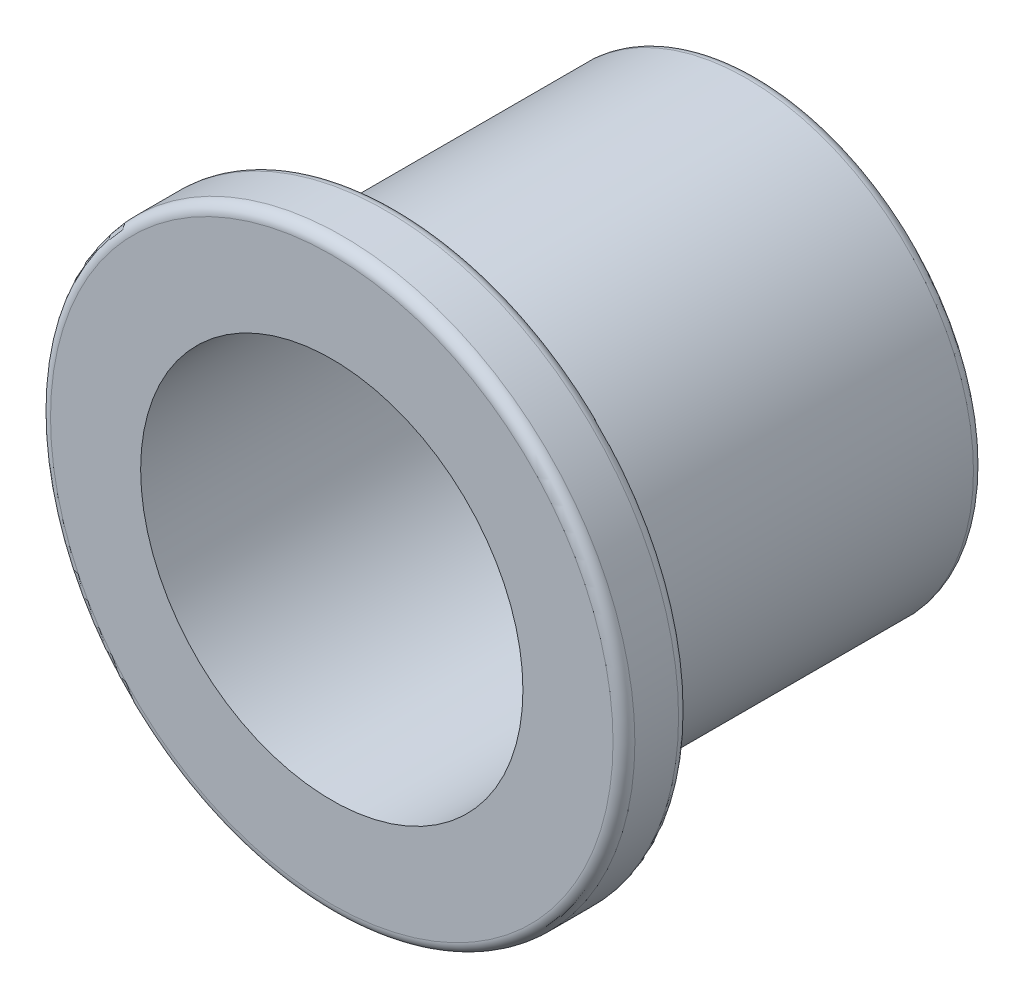
ISO-10303-21;
HEADER;
FILE_DESCRIPTION(('STEP AP214'),'2;1');
FILE_NAME('part.step','',(''),(''),'','','');
FILE_SCHEMA(('AUTOMOTIVE_DESIGN { 1 0 10303 214 1 1 1 1 }'));
ENDSEC;
DATA;
#1=APPLICATION_CONTEXT('core data for automotive mechanical design processes');
#2=APPLICATION_PROTOCOL_DEFINITION('international standard','automotive_design',2000,#1);
#3=PRODUCT_CONTEXT('',#1,'mechanical');
#4=PRODUCT('Part','Part','',(#3));
#5=PRODUCT_RELATED_PRODUCT_CATEGORY('part','',(#4));
#6=PRODUCT_DEFINITION_FORMATION('','',#4);
#7=PRODUCT_DEFINITION_CONTEXT('part definition',#1,'design');
#8=PRODUCT_DEFINITION('design','',#6,#7);
#9=PRODUCT_DEFINITION_SHAPE('','',#8);
#10=(LENGTH_UNIT() NAMED_UNIT(*) SI_UNIT(.MILLI.,.METRE.));
#11=(NAMED_UNIT(*) PLANE_ANGLE_UNIT() SI_UNIT($,.RADIAN.));
#12=(NAMED_UNIT(*) SI_UNIT($,.STERADIAN.) SOLID_ANGLE_UNIT());
#13=UNCERTAINTY_MEASURE_WITH_UNIT(LENGTH_MEASURE(1.E-05),#10,'distance_accuracy_value','');
#14=(GEOMETRIC_REPRESENTATION_CONTEXT(3) GLOBAL_UNCERTAINTY_ASSIGNED_CONTEXT((#13)) GLOBAL_UNIT_ASSIGNED_CONTEXT((#10,
#11,#12)) REPRESENTATION_CONTEXT('',''));
#15=CARTESIAN_POINT('',(0.,0.,0.));
#16=DIRECTION('',(0.,0.,1.));
#17=DIRECTION('',(1.,0.,0.));
#18=AXIS2_PLACEMENT_3D('',#15,#16,#17);
#19=CARTESIAN_POINT('',(0.,0.,-7.8));
#20=DIRECTION('',(0.,0.,-1.));
#21=DIRECTION('',(-1.,0.,0.));
#22=AXIS2_PLACEMENT_3D('',#19,#20,#21);
#23=PLANE('',#22);
#24=CARTESIAN_POINT('',(0.,0.,-7.8));
#25=DIRECTION('',(0.,0.,-1.));
#26=DIRECTION('',(-1.,0.,0.));
#27=AXIS2_PLACEMENT_3D('',#24,#25,#26);
#28=CIRCLE('',#27,3.95);
#29=CARTESIAN_POINT('',(-3.95,0.,-7.8));
#30=VERTEX_POINT('',#29);
#31=EDGE_CURVE('E71',#30,#30,#28,.T.);
#32=ORIENTED_EDGE('',*,*,#31,.T.);
#33=EDGE_LOOP('',(#32));
#34=FACE_BOUND('',#33,.T.);
#35=CARTESIAN_POINT('',(0.,0.,-7.8));
#36=DIRECTION('',(0.,0.,-1.));
#37=DIRECTION('',(-1.,0.,0.));
#38=AXIS2_PLACEMENT_3D('',#35,#36,#37);
#39=CIRCLE('',#38,3.5);
#40=CARTESIAN_POINT('',(-3.5,0.,-7.8));
#41=VERTEX_POINT('',#40);
#42=EDGE_CURVE('E83',#41,#41,#39,.T.);
#43=ORIENTED_EDGE('',*,*,#42,.F.);
#44=EDGE_LOOP('',(#43));
#45=FACE_BOUND('',#44,.T.);
#46=ADVANCED_FACE('F39',(#34,#45),#23,.T.);
#47=CARTESIAN_POINT('',(0.,0.,0.));
#48=DIRECTION('',(0.,0.,1.));
#49=DIRECTION('',(1.,0.,0.));
#50=AXIS2_PLACEMENT_3D('',#47,#48,#49);
#51=CYLINDRICAL_SURFACE('',#50,5.35);
#52=CARTESIAN_POINT('',(0.,0.,-0.2));
#53=DIRECTION('',(0.,0.,1.));
#54=DIRECTION('',(1.,0.,0.));
#55=AXIS2_PLACEMENT_3D('',#52,#53,#54);
#56=CIRCLE('',#55,5.35);
#57=CARTESIAN_POINT('',(5.35,0.,-0.2));
#58=VERTEX_POINT('',#57);
#59=EDGE_CURVE('E47',#58,#58,#56,.F.);
#60=ORIENTED_EDGE('',*,*,#59,.T.);
#61=EDGE_LOOP('',(#60));
#62=FACE_BOUND('',#61,.T.);
#63=CARTESIAN_POINT('',(0.,0.,-1.));
#64=DIRECTION('',(0.,0.,1.));
#65=DIRECTION('',(1.,0.,0.));
#66=AXIS2_PLACEMENT_3D('',#63,#64,#65);
#67=CIRCLE('',#66,5.35);
#68=CARTESIAN_POINT('',(5.35,0.,-1.));
#69=VERTEX_POINT('',#68);
#70=EDGE_CURVE('E52',#69,#69,#67,.T.);
#71=ORIENTED_EDGE('',*,*,#70,.T.);
#72=EDGE_LOOP('',(#71));
#73=FACE_BOUND('',#72,.T.);
#74=ADVANCED_FACE('F91',(#62,#73),#51,.T.);
#75=CARTESIAN_POINT('',(0.,0.,0.));
#76=DIRECTION('',(0.,0.,1.));
#77=DIRECTION('',(1.,0.,0.));
#78=AXIS2_PLACEMENT_3D('',#75,#76,#77);
#79=PLANE('',#78);
#80=CARTESIAN_POINT('',(0.,0.,0.));
#81=DIRECTION('',(0.,0.,1.));
#82=DIRECTION('',(1.,0.,0.));
#83=AXIS2_PLACEMENT_3D('',#80,#81,#82);
#84=CIRCLE('',#83,5.15);
#85=CARTESIAN_POINT('',(5.15,0.,0.));
#86=VERTEX_POINT('',#85);
#87=EDGE_CURVE('E57',#86,#86,#84,.T.);
#88=ORIENTED_EDGE('',*,*,#87,.T.);
#89=EDGE_LOOP('',(#88));
#90=FACE_BOUND('',#89,.T.);
#91=CARTESIAN_POINT('',(0.,0.,0.));
#92=DIRECTION('',(0.,0.,1.));
#93=DIRECTION('',(1.,0.,0.));
#94=AXIS2_PLACEMENT_3D('',#91,#92,#93);
#95=CIRCLE('',#94,3.5);
#96=CARTESIAN_POINT('',(3.5,0.,0.));
#97=VERTEX_POINT('',#96);
#98=EDGE_CURVE('E79',#97,#97,#95,.T.);
#99=ORIENTED_EDGE('',*,*,#98,.F.);
#100=EDGE_LOOP('',(#99));
#101=FACE_BOUND('',#100,.T.);
#102=ADVANCED_FACE('F97',(#90,#101),#79,.T.);
#103=CARTESIAN_POINT('',(0.,0.,0.200000000000001));
#104=DIRECTION('',(0.,0.,-1.));
#105=DIRECTION('',(-1.,0.,0.));
#106=AXIS2_PLACEMENT_3D('',#103,#104,#105);
#107=CYLINDRICAL_SURFACE('',#106,3.5);
#108=ORIENTED_EDGE('',*,*,#98,.T.);
#109=EDGE_LOOP('',(#108));
#110=FACE_BOUND('',#109,.T.);
#111=ORIENTED_EDGE('',*,*,#42,.T.);
#112=EDGE_LOOP('',(#111));
#113=FACE_BOUND('',#112,.T.);
#114=ADVANCED_FACE('F88',(#110,#113),#107,.F.);
#115=CARTESIAN_POINT('',(0.,0.,-1.2));
#116=DIRECTION('',(0.,0.,1.));
#117=DIRECTION('',(1.,0.,0.));
#118=AXIS2_PLACEMENT_3D('',#115,#116,#117);
#119=CYLINDRICAL_SURFACE('',#118,4.15);
#120=CARTESIAN_POINT('',(0.,0.,-1.4));
#121=DIRECTION('',(0.,0.,1.));
#122=DIRECTION('',(1.,0.,0.));
#123=AXIS2_PLACEMENT_3D('',#120,#121,#122);
#124=CIRCLE('',#123,4.15);
#125=CARTESIAN_POINT('',(4.15,0.,-1.4));
#126=VERTEX_POINT('',#125);
#127=EDGE_CURVE('E63',#126,#126,#124,.F.);
#128=ORIENTED_EDGE('',*,*,#127,.T.);
#129=EDGE_LOOP('',(#128));
#130=FACE_BOUND('',#129,.T.);
#131=CARTESIAN_POINT('',(0.,0.,-7.6));
#132=DIRECTION('',(0.,0.,-1.));
#133=DIRECTION('',(-1.,0.,0.));
#134=AXIS2_PLACEMENT_3D('',#131,#132,#133);
#135=CIRCLE('',#134,4.15);
#136=CARTESIAN_POINT('',(-4.15,0.,-7.6));
#137=VERTEX_POINT('',#136);
#138=EDGE_CURVE('E75',#137,#137,#135,.F.);
#139=ORIENTED_EDGE('',*,*,#138,.T.);
#140=EDGE_LOOP('',(#139));
#141=FACE_BOUND('',#140,.T.);
#142=ADVANCED_FACE('F124',(#130,#141),#119,.T.);
#143=CARTESIAN_POINT('',(5.35,0.,-1.2));
#144=DIRECTION('',(0.,0.,1.));
#145=DIRECTION('',(1.,0.,0.));
#146=AXIS2_PLACEMENT_3D('',#143,#144,#145);
#147=PLANE('',#146);
#148=CARTESIAN_POINT('',(0.,0.,-1.2));
#149=DIRECTION('',(0.,0.,1.));
#150=DIRECTION('',(1.,0.,0.));
#151=AXIS2_PLACEMENT_3D('',#148,#149,#150);
#152=CIRCLE('',#151,5.15);
#153=CARTESIAN_POINT('',(5.15,0.,-1.2));
#154=VERTEX_POINT('',#153);
#155=EDGE_CURVE('E10',#154,#154,#152,.F.);
#156=ORIENTED_EDGE('',*,*,#155,.T.);
#157=EDGE_LOOP('',(#156));
#158=FACE_BOUND('',#157,.T.);
#159=CARTESIAN_POINT('',(0.,0.,-1.2));
#160=DIRECTION('',(0.,0.,1.));
#161=DIRECTION('',(1.,0.,0.));
#162=AXIS2_PLACEMENT_3D('',#159,#160,#161);
#163=CIRCLE('',#162,4.35);
#164=CARTESIAN_POINT('',(4.35,0.,-1.2));
#165=VERTEX_POINT('',#164);
#166=EDGE_CURVE('E67',#165,#165,#163,.T.);
#167=ORIENTED_EDGE('',*,*,#166,.T.);
#168=EDGE_LOOP('',(#167));
#169=FACE_BOUND('',#168,.T.);
#170=ADVANCED_FACE('F105',(#158,#169),#147,.F.);
#171=CARTESIAN_POINT('',(0.,0.,-7.6));
#172=DIRECTION('',(0.,0.,-1.));
#173=DIRECTION('',(-1.,0.,0.));
#174=AXIS2_PLACEMENT_3D('',#171,#172,#173);
#175=TOROIDAL_SURFACE('',#174,3.95,0.2);
#176=ORIENTED_EDGE('',*,*,#31,.F.);
#177=EDGE_LOOP('',(#176));
#178=FACE_BOUND('',#177,.T.);
#179=ORIENTED_EDGE('',*,*,#138,.F.);
#180=EDGE_LOOP('',(#179));
#181=FACE_BOUND('',#180,.T.);
#182=ADVANCED_FACE('F101',(#178,#181),#175,.T.);
#183=CARTESIAN_POINT('',(0.,0.,-1.4));
#184=DIRECTION('',(0.,0.,1.));
#185=DIRECTION('',(1.,0.,0.));
#186=AXIS2_PLACEMENT_3D('',#183,#184,#185);
#187=TOROIDAL_SURFACE('',#186,4.35,0.2);
#188=ORIENTED_EDGE('',*,*,#127,.F.);
#189=EDGE_LOOP('',(#188));
#190=FACE_BOUND('',#189,.T.);
#191=ORIENTED_EDGE('',*,*,#166,.F.);
#192=EDGE_LOOP('',(#191));
#193=FACE_BOUND('',#192,.T.);
#194=ADVANCED_FACE('F104',(#190,#193),#187,.F.);
#195=CARTESIAN_POINT('',(0.,0.,-0.2));
#196=DIRECTION('',(0.,0.,1.));
#197=DIRECTION('',(1.,0.,0.));
#198=AXIS2_PLACEMENT_3D('',#195,#196,#197);
#199=TOROIDAL_SURFACE('',#198,5.15,0.2);
#200=ORIENTED_EDGE('',*,*,#59,.F.);
#201=EDGE_LOOP('',(#200));
#202=FACE_BOUND('',#201,.T.);
#203=ORIENTED_EDGE('',*,*,#87,.F.);
#204=EDGE_LOOP('',(#203));
#205=FACE_BOUND('',#204,.T.);
#206=ADVANCED_FACE('F108',(#202,#205),#199,.T.);
#207=CARTESIAN_POINT('',(0.,0.,-1.));
#208=DIRECTION('',(0.,0.,1.));
#209=DIRECTION('',(1.,0.,0.));
#210=AXIS2_PLACEMENT_3D('',#207,#208,#209);
#211=TOROIDAL_SURFACE('',#210,5.15,0.2);
#212=ORIENTED_EDGE('',*,*,#155,.F.);
#213=EDGE_LOOP('',(#212));
#214=FACE_BOUND('',#213,.T.);
#215=ORIENTED_EDGE('',*,*,#70,.F.);
#216=EDGE_LOOP('',(#215));
#217=FACE_BOUND('',#216,.T.);
#218=ADVANCED_FACE('F41',(#214,#217),#211,.T.);
#219=CLOSED_SHELL('',(#46,#74,#102,#114,#142,#170,#182,#194,#206,#218));
#220=MANIFOLD_SOLID_BREP('B2',#219);
#221=ADVANCED_BREP_SHAPE_REPRESENTATION('',(#18,#220),#14);
#222=SHAPE_DEFINITION_REPRESENTATION(#9,#221);
ENDSEC;
END-ISO-10303-21;
